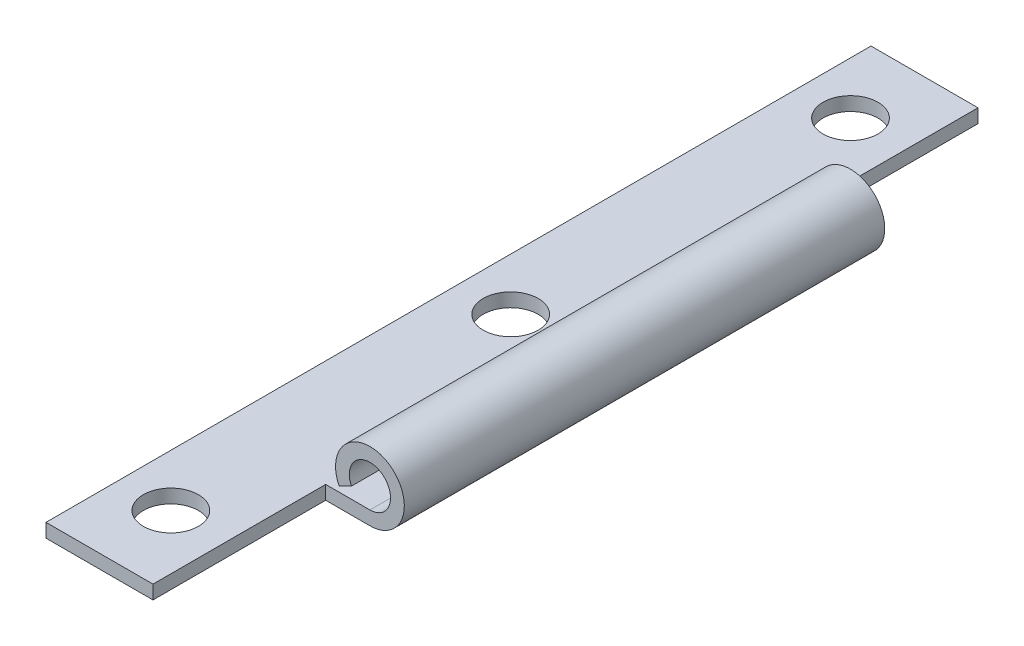
ISO-10303-21;
HEADER;
FILE_DESCRIPTION(('STEP AP214'),'2;1');
FILE_NAME('part.step','',(''),(''),'','','');
FILE_SCHEMA(('AUTOMOTIVE_DESIGN { 1 0 10303 214 1 1 1 1 }'));
ENDSEC;
DATA;
#1=APPLICATION_CONTEXT('core data for automotive mechanical design processes');
#2=APPLICATION_PROTOCOL_DEFINITION('international standard','automotive_design',2000,#1);
#3=PRODUCT_CONTEXT('',#1,'mechanical');
#4=PRODUCT('Part','Part','',(#3));
#5=PRODUCT_RELATED_PRODUCT_CATEGORY('part','',(#4));
#6=PRODUCT_DEFINITION_FORMATION('','',#4);
#7=PRODUCT_DEFINITION_CONTEXT('part definition',#1,'design');
#8=PRODUCT_DEFINITION('design','',#6,#7);
#9=PRODUCT_DEFINITION_SHAPE('','',#8);
#10=(LENGTH_UNIT() NAMED_UNIT(*) SI_UNIT(.MILLI.,.METRE.));
#11=(NAMED_UNIT(*) PLANE_ANGLE_UNIT() SI_UNIT($,.RADIAN.));
#12=(NAMED_UNIT(*) SI_UNIT($,.STERADIAN.) SOLID_ANGLE_UNIT());
#13=UNCERTAINTY_MEASURE_WITH_UNIT(LENGTH_MEASURE(1.E-05),#10,'distance_accuracy_value','');
#14=(GEOMETRIC_REPRESENTATION_CONTEXT(3) GLOBAL_UNCERTAINTY_ASSIGNED_CONTEXT((#13)) GLOBAL_UNIT_ASSIGNED_CONTEXT((#10,
#11,#12)) REPRESENTATION_CONTEXT('',''));
#15=CARTESIAN_POINT('',(0.,0.,0.));
#16=DIRECTION('',(0.,0.,1.));
#17=DIRECTION('',(1.,0.,0.));
#18=AXIS2_PLACEMENT_3D('',#15,#16,#17);
#19=CARTESIAN_POINT('',(11.,2.5,0.));
#20=DIRECTION('',(0.,0.,1.));
#21=DIRECTION('',(1.,0.,0.));
#22=AXIS2_PLACEMENT_3D('',#19,#20,#21);
#23=CYLINDRICAL_SURFACE('',#22,1.5);
#24=CARTESIAN_POINT('',(11.,2.5,12.5));
#25=DIRECTION('',(0.,0.,1.));
#26=DIRECTION('',(0.,-1.,0.));
#27=AXIS2_PLACEMENT_3D('',#24,#25,#26);
#28=CIRCLE('',#27,1.5);
#29=CARTESIAN_POINT('',(11.,0.999999999999996,12.5));
#30=VERTEX_POINT('',#29);
#31=CARTESIAN_POINT('',(9.65746444339179,1.83097213866484,12.5));
#32=VERTEX_POINT('',#31);
#33=EDGE_CURVE('E46',#30,#32,#28,.T.);
#34=ORIENTED_EDGE('',*,*,#33,.F.);
#35=DIRECTION('',(0.,0.,1.));
#36=VECTOR('',#35,1.);
#37=CARTESIAN_POINT('',(11.,1.,0.));
#38=LINE('',#37,#36);
#39=CARTESIAN_POINT('',(11.,0.999999999999996,47.4412303069812));
#40=VERTEX_POINT('',#39);
#41=EDGE_CURVE('E164',#30,#40,#38,.T.);
#42=ORIENTED_EDGE('',*,*,#41,.T.);
#43=CARTESIAN_POINT('',(11.,2.5,47.4412303069812));
#44=DIRECTION('',(0.,0.,-1.));
#45=DIRECTION('',(0.,1.,0.));
#46=AXIS2_PLACEMENT_3D('',#43,#44,#45);
#47=CIRCLE('',#46,1.5);
#48=CARTESIAN_POINT('',(9.65746444339179,1.83097213866484,47.4412303069812));
#49=VERTEX_POINT('',#48);
#50=EDGE_CURVE('E150',#49,#40,#47,.T.);
#51=ORIENTED_EDGE('',*,*,#50,.F.);
#52=DIRECTION('',(0.,0.,1.));
#53=VECTOR('',#52,1.);
#54=CARTESIAN_POINT('',(9.65746444339179,1.83097213866484,0.));
#55=LINE('',#54,#53);
#56=EDGE_CURVE('E188',#32,#49,#55,.T.);
#57=ORIENTED_EDGE('',*,*,#56,.F.);
#58=EDGE_LOOP('',(#34,#42,#51,#57));
#59=FACE_BOUND('',#58,.T.);
#60=ADVANCED_FACE('F33',(#59),#23,.F.);
#61=CARTESIAN_POINT('',(11.,2.5,0.));
#62=DIRECTION('',(0.,0.,1.));
#63=DIRECTION('',(1.,0.,0.));
#64=AXIS2_PLACEMENT_3D('',#61,#62,#63);
#65=CYLINDRICAL_SURFACE('',#64,2.5);
#66=CARTESIAN_POINT('',(11.,2.5,12.5));
#67=DIRECTION('',(0.,0.,1.));
#68=DIRECTION('',(0.,-1.,0.));
#69=AXIS2_PLACEMENT_3D('',#66,#67,#68);
#70=CIRCLE('',#69,2.5);
#71=CARTESIAN_POINT('',(8.76244073898632,1.3849535644414,12.5));
#72=VERTEX_POINT('',#71);
#73=CARTESIAN_POINT('',(11.,0.,12.5));
#74=VERTEX_POINT('',#73);
#75=EDGE_CURVE('E122',#72,#74,#70,.F.);
#76=ORIENTED_EDGE('',*,*,#75,.F.);
#77=DIRECTION('',(0.,0.,-1.));
#78=VECTOR('',#77,1.);
#79=CARTESIAN_POINT('',(8.76244073898632,1.38495356444141,0.));
#80=LINE('',#79,#78);
#81=CARTESIAN_POINT('',(8.76244073898632,1.3849535644414,47.4412303069812));
#82=VERTEX_POINT('',#81);
#83=EDGE_CURVE('E185',#82,#72,#80,.T.);
#84=ORIENTED_EDGE('',*,*,#83,.F.);
#85=CARTESIAN_POINT('',(11.,2.5,47.4412303069812));
#86=DIRECTION('',(0.,0.,-1.));
#87=DIRECTION('',(0.,1.,0.));
#88=AXIS2_PLACEMENT_3D('',#85,#86,#87);
#89=CIRCLE('',#88,2.5);
#90=CARTESIAN_POINT('',(11.,0.,47.4412303069812));
#91=VERTEX_POINT('',#90);
#92=EDGE_CURVE('E54',#91,#82,#89,.F.);
#93=ORIENTED_EDGE('',*,*,#92,.F.);
#94=DIRECTION('',(0.,0.,-1.));
#95=VECTOR('',#94,1.);
#96=CARTESIAN_POINT('',(11.,0.,0.));
#97=LINE('',#96,#95);
#98=EDGE_CURVE('E166',#91,#74,#97,.T.);
#99=ORIENTED_EDGE('',*,*,#98,.T.);
#100=EDGE_LOOP('',(#76,#84,#93,#99));
#101=FACE_BOUND('',#100,.T.);
#102=ADVANCED_FACE('F220',(#101),#65,.T.);
#103=CARTESIAN_POINT('',(11.,0.,0.));
#104=DIRECTION('',(0.,0.,1.));
#105=DIRECTION('',(1.,0.,0.));
#106=AXIS2_PLACEMENT_3D('',#103,#104,#105);
#107=PLANE('',#106);
#108=DIRECTION('',(-1.,0.,0.));
#109=VECTOR('',#108,1.);
#110=CARTESIAN_POINT('',(11.,1.,0.));
#111=LINE('',#110,#109);
#112=CARTESIAN_POINT('',(7.78103687233056,1.,0.));
#113=VERTEX_POINT('',#112);
#114=CARTESIAN_POINT('',(0.,1.,0.));
#115=VERTEX_POINT('',#114);
#116=EDGE_CURVE('E183',#113,#115,#111,.T.);
#117=ORIENTED_EDGE('',*,*,#116,.F.);
#118=DIRECTION('',(0.,-1.,0.));
#119=VECTOR('',#118,1.);
#120=CARTESIAN_POINT('',(7.78103687233056,0.,0.));
#121=LINE('',#120,#119);
#122=CARTESIAN_POINT('',(7.78103687233056,0.,0.));
#123=VERTEX_POINT('',#122);
#124=EDGE_CURVE('E143',#113,#123,#121,.T.);
#125=ORIENTED_EDGE('',*,*,#124,.T.);
#126=DIRECTION('',(-1.,0.,0.));
#127=VECTOR('',#126,1.);
#128=CARTESIAN_POINT('',(11.,0.,0.));
#129=LINE('',#128,#127);
#130=CARTESIAN_POINT('',(0.,0.,0.));
#131=VERTEX_POINT('',#130);
#132=EDGE_CURVE('E130',#123,#131,#129,.T.);
#133=ORIENTED_EDGE('',*,*,#132,.T.);
#134=DIRECTION('',(0.,1.,0.));
#135=VECTOR('',#134,1.);
#136=CARTESIAN_POINT('',(0.,0.,0.));
#137=LINE('',#136,#135);
#138=EDGE_CURVE('E163',#131,#115,#137,.T.);
#139=ORIENTED_EDGE('',*,*,#138,.T.);
#140=EDGE_LOOP('',(#117,#125,#133,#139));
#141=FACE_BOUND('',#140,.T.);
#142=ADVANCED_FACE('F207',(#141),#107,.F.);
#143=CARTESIAN_POINT('',(11.,1.,0.));
#144=DIRECTION('',(0.,-1.,0.));
#145=DIRECTION('',(0.,0.,-1.));
#146=AXIS2_PLACEMENT_3D('',#143,#144,#145);
#147=PLANE('',#146);
#148=CARTESIAN_POINT('',(3.79458369093268,0.999999999999996,30.));
#149=DIRECTION('',(0.,1.,0.));
#150=DIRECTION('',(0.,0.,1.));
#151=AXIS2_PLACEMENT_3D('',#148,#149,#150);
#152=CIRCLE('',#151,2.);
#153=CARTESIAN_POINT('',(3.79458369093268,0.999999999999996,32.));
#154=VERTEX_POINT('',#153);
#155=EDGE_CURVE('E267',#154,#154,#152,.T.);
#156=ORIENTED_EDGE('',*,*,#155,.F.);
#157=EDGE_LOOP('',(#156));
#158=FACE_BOUND('',#157,.T.);
#159=CARTESIAN_POINT('',(3.79458369093236,0.999999999999993,54.7141334830729));
#160=DIRECTION('',(0.,1.,0.));
#161=DIRECTION('',(0.,0.,-1.));
#162=AXIS2_PLACEMENT_3D('',#159,#160,#161);
#163=CIRCLE('',#162,2.);
#164=CARTESIAN_POINT('',(3.79458369093236,0.999999999999994,52.7141334830729));
#165=VERTEX_POINT('',#164);
#166=EDGE_CURVE('E269',#165,#165,#163,.T.);
#167=ORIENTED_EDGE('',*,*,#166,.F.);
#168=EDGE_LOOP('',(#167));
#169=FACE_BOUND('',#168,.T.);
#170=CARTESIAN_POINT('',(3.79458369093236,0.999999999999999,5.28586651692707));
#171=DIRECTION('',(0.,1.,0.));
#172=DIRECTION('',(0.,0.,1.));
#173=AXIS2_PLACEMENT_3D('',#170,#171,#172);
#174=CIRCLE('',#173,2.);
#175=CARTESIAN_POINT('',(3.79458369093236,0.999999999999999,7.28586651692707));
#176=VERTEX_POINT('',#175);
#177=EDGE_CURVE('E134',#176,#176,#174,.T.);
#178=ORIENTED_EDGE('',*,*,#177,.F.);
#179=EDGE_LOOP('',(#178));
#180=FACE_BOUND('',#179,.T.);
#181=DIRECTION('',(-1.,0.,0.));
#182=VECTOR('',#181,1.);
#183=CARTESIAN_POINT('',(11.,0.999999999999999,12.5));
#184=LINE('',#183,#182);
#185=CARTESIAN_POINT('',(7.78103687233056,0.999999999999998,12.5));
#186=VERTEX_POINT('',#185);
#187=EDGE_CURVE('E139',#30,#186,#184,.T.);
#188=ORIENTED_EDGE('',*,*,#187,.T.);
#189=DIRECTION('',(0.,0.,-1.));
#190=VECTOR('',#189,1.);
#191=CARTESIAN_POINT('',(7.78103687233056,1.,0.));
#192=LINE('',#191,#190);
#193=EDGE_CURVE('E116',#186,#113,#192,.T.);
#194=ORIENTED_EDGE('',*,*,#193,.T.);
#195=ORIENTED_EDGE('',*,*,#116,.T.);
#196=DIRECTION('',(0.,0.,1.));
#197=VECTOR('',#196,1.);
#198=CARTESIAN_POINT('',(0.,1.,0.));
#199=LINE('',#198,#197);
#200=CARTESIAN_POINT('',(0.,0.999999999999993,60.));
#201=VERTEX_POINT('',#200);
#202=EDGE_CURVE('E171',#115,#201,#199,.T.);
#203=ORIENTED_EDGE('',*,*,#202,.T.);
#204=DIRECTION('',(-1.,0.,0.));
#205=VECTOR('',#204,1.);
#206=CARTESIAN_POINT('',(11.,0.999999999999993,60.));
#207=LINE('',#206,#205);
#208=CARTESIAN_POINT('',(7.78103687233056,0.999999999999993,60.));
#209=VERTEX_POINT('',#208);
#210=EDGE_CURVE('E181',#209,#201,#207,.T.);
#211=ORIENTED_EDGE('',*,*,#210,.F.);
#212=DIRECTION('',(0.,0.,-1.));
#213=VECTOR('',#212,1.);
#214=CARTESIAN_POINT('',(7.78103687233056,1.,0.));
#215=LINE('',#214,#213);
#216=CARTESIAN_POINT('',(7.78103687233056,0.999999999999994,47.4412303069812));
#217=VERTEX_POINT('',#216);
#218=EDGE_CURVE('E160',#209,#217,#215,.T.);
#219=ORIENTED_EDGE('',*,*,#218,.T.);
#220=DIRECTION('',(1.,0.,0.));
#221=VECTOR('',#220,1.);
#222=CARTESIAN_POINT('',(11.,0.999999999999994,47.4412303069812));
#223=LINE('',#222,#221);
#224=EDGE_CURVE('E153',#217,#40,#223,.T.);
#225=ORIENTED_EDGE('',*,*,#224,.T.);
#226=ORIENTED_EDGE('',*,*,#41,.F.);
#227=EDGE_LOOP('',(#188,#194,#195,#203,#211,#219,#225,#226));
#228=FACE_BOUND('',#227,.T.);
#229=ADVANCED_FACE('F209',(#158,#169,#180,#228),#147,.F.);
#230=CARTESIAN_POINT('',(11.,0.,60.));
#231=DIRECTION('',(0.,0.,-1.));
#232=DIRECTION('',(-1.,0.,0.));
#233=AXIS2_PLACEMENT_3D('',#230,#231,#232);
#234=PLANE('',#233);
#235=DIRECTION('',(-1.,0.,0.));
#236=VECTOR('',#235,1.);
#237=CARTESIAN_POINT('',(11.,0.,60.));
#238=LINE('',#237,#236);
#239=CARTESIAN_POINT('',(7.78103687233056,0.,60.));
#240=VERTEX_POINT('',#239);
#241=CARTESIAN_POINT('',(0.,0.,60.));
#242=VERTEX_POINT('',#241);
#243=EDGE_CURVE('E179',#240,#242,#238,.T.);
#244=ORIENTED_EDGE('',*,*,#243,.F.);
#245=DIRECTION('',(0.,1.,0.));
#246=VECTOR('',#245,1.);
#247=CARTESIAN_POINT('',(7.78103687233056,0.,60.));
#248=LINE('',#247,#246);
#249=EDGE_CURVE('E152',#240,#209,#248,.T.);
#250=ORIENTED_EDGE('',*,*,#249,.T.);
#251=ORIENTED_EDGE('',*,*,#210,.T.);
#252=DIRECTION('',(0.,-1.,0.));
#253=VECTOR('',#252,1.);
#254=CARTESIAN_POINT('',(0.,0.,60.));
#255=LINE('',#254,#253);
#256=EDGE_CURVE('E174',#201,#242,#255,.T.);
#257=ORIENTED_EDGE('',*,*,#256,.T.);
#258=EDGE_LOOP('',(#244,#250,#251,#257));
#259=FACE_BOUND('',#258,.T.);
#260=ADVANCED_FACE('F197',(#259),#234,.F.);
#261=CARTESIAN_POINT('',(11.,0.,0.));
#262=DIRECTION('',(0.,1.,0.));
#263=DIRECTION('',(0.,0.,1.));
#264=AXIS2_PLACEMENT_3D('',#261,#262,#263);
#265=PLANE('',#264);
#266=CARTESIAN_POINT('',(3.79458369093268,0.,30.));
#267=DIRECTION('',(0.,1.,0.));
#268=DIRECTION('',(0.,0.,1.));
#269=AXIS2_PLACEMENT_3D('',#266,#267,#268);
#270=CIRCLE('',#269,2.);
#271=CARTESIAN_POINT('',(3.79458369093268,0.,32.));
#272=VERTEX_POINT('',#271);
#273=EDGE_CURVE('E264',#272,#272,#270,.T.);
#274=ORIENTED_EDGE('',*,*,#273,.T.);
#275=EDGE_LOOP('',(#274));
#276=FACE_BOUND('',#275,.T.);
#277=CARTESIAN_POINT('',(3.79458369093236,0.,54.7141334830729));
#278=DIRECTION('',(0.,1.,0.));
#279=DIRECTION('',(0.,0.,-1.));
#280=AXIS2_PLACEMENT_3D('',#277,#278,#279);
#281=CIRCLE('',#280,2.);
#282=CARTESIAN_POINT('',(3.79458369093236,0.,52.7141334830729));
#283=VERTEX_POINT('',#282);
#284=EDGE_CURVE('E272',#283,#283,#281,.T.);
#285=ORIENTED_EDGE('',*,*,#284,.T.);
#286=EDGE_LOOP('',(#285));
#287=FACE_BOUND('',#286,.T.);
#288=CARTESIAN_POINT('',(3.79458369093236,0.,5.28586651692707));
#289=DIRECTION('',(0.,1.,0.));
#290=DIRECTION('',(0.,0.,1.));
#291=AXIS2_PLACEMENT_3D('',#288,#289,#290);
#292=CIRCLE('',#291,2.);
#293=CARTESIAN_POINT('',(3.79458369093236,0.,7.28586651692707));
#294=VERTEX_POINT('',#293);
#295=EDGE_CURVE('E131',#294,#294,#292,.T.);
#296=ORIENTED_EDGE('',*,*,#295,.T.);
#297=EDGE_LOOP('',(#296));
#298=FACE_BOUND('',#297,.T.);
#299=ORIENTED_EDGE('',*,*,#132,.F.);
#300=DIRECTION('',(0.,0.,-1.));
#301=VECTOR('',#300,1.);
#302=CARTESIAN_POINT('',(7.78103687233056,0.,-0.967623064578414));
#303=LINE('',#302,#301);
#304=CARTESIAN_POINT('',(7.78103687233056,0.,12.5));
#305=VERTEX_POINT('',#304);
#306=EDGE_CURVE('E113',#305,#123,#303,.T.);
#307=ORIENTED_EDGE('',*,*,#306,.F.);
#308=DIRECTION('',(-1.,0.,0.));
#309=VECTOR('',#308,1.);
#310=CARTESIAN_POINT('',(16.0412965863501,0.,12.5));
#311=LINE('',#310,#309);
#312=EDGE_CURVE('E118',#74,#305,#311,.T.);
#313=ORIENTED_EDGE('',*,*,#312,.F.);
#314=ORIENTED_EDGE('',*,*,#98,.F.);
#315=DIRECTION('',(1.,0.,0.));
#316=VECTOR('',#315,1.);
#317=CARTESIAN_POINT('',(15.8791395617148,0.,47.4412303069812));
#318=LINE('',#317,#316);
#319=CARTESIAN_POINT('',(7.78103687233056,0.,47.4412303069812));
#320=VERTEX_POINT('',#319);
#321=EDGE_CURVE('E145',#320,#91,#318,.T.);
#322=ORIENTED_EDGE('',*,*,#321,.F.);
#323=DIRECTION('',(0.,0.,1.));
#324=VECTOR('',#323,1.);
#325=CARTESIAN_POINT('',(7.78103687233056,0.,0.));
#326=LINE('',#325,#324);
#327=EDGE_CURVE('E40',#320,#240,#326,.T.);
#328=ORIENTED_EDGE('',*,*,#327,.T.);
#329=ORIENTED_EDGE('',*,*,#243,.T.);
#330=DIRECTION('',(0.,0.,-1.));
#331=VECTOR('',#330,1.);
#332=CARTESIAN_POINT('',(0.,0.,0.));
#333=LINE('',#332,#331);
#334=EDGE_CURVE('E167',#242,#131,#333,.T.);
#335=ORIENTED_EDGE('',*,*,#334,.T.);
#336=EDGE_LOOP('',(#299,#307,#313,#314,#322,#328,#329,#335));
#337=FACE_BOUND('',#336,.T.);
#338=ADVANCED_FACE('F128',(#276,#287,#298,#337),#265,.F.);
#339=CARTESIAN_POINT('',(8.76244073898632,1.38495356444141,0.));
#340=DIRECTION('',(0.446018574223438,-0.895023704405471,0.));
#341=DIRECTION('',(0.,0.,-1.));
#342=AXIS2_PLACEMENT_3D('',#339,#340,#341);
#343=PLANE('',#342);
#344=DIRECTION('',(-0.895023704405471,-0.446018574223438,0.));
#345=VECTOR('',#344,1.);
#346=CARTESIAN_POINT('',(8.76244073898632,1.38495356444141,12.5));
#347=LINE('',#346,#345);
#348=EDGE_CURVE('E11',#32,#72,#347,.T.);
#349=ORIENTED_EDGE('',*,*,#348,.F.);
#350=ORIENTED_EDGE('',*,*,#56,.T.);
#351=DIRECTION('',(0.895023704405471,0.446018574223438,0.));
#352=VECTOR('',#351,1.);
#353=CARTESIAN_POINT('',(8.76244073898632,1.38495356444141,47.4412303069812));
#354=LINE('',#353,#352);
#355=EDGE_CURVE('E190',#82,#49,#354,.T.);
#356=ORIENTED_EDGE('',*,*,#355,.F.);
#357=ORIENTED_EDGE('',*,*,#83,.T.);
#358=EDGE_LOOP('',(#349,#350,#356,#357));
#359=FACE_BOUND('',#358,.T.);
#360=ADVANCED_FACE('F215',(#359),#343,.T.);
#361=CARTESIAN_POINT('',(0.,0.,0.));
#362=DIRECTION('',(1.,0.,0.));
#363=DIRECTION('',(0.,0.,-1.));
#364=AXIS2_PLACEMENT_3D('',#361,#362,#363);
#365=PLANE('',#364);
#366=ORIENTED_EDGE('',*,*,#138,.F.);
#367=ORIENTED_EDGE('',*,*,#334,.F.);
#368=ORIENTED_EDGE('',*,*,#256,.F.);
#369=ORIENTED_EDGE('',*,*,#202,.F.);
#370=EDGE_LOOP('',(#366,#367,#368,#369));
#371=FACE_BOUND('',#370,.T.);
#372=ADVANCED_FACE('F204',(#371),#365,.F.);
#373=CARTESIAN_POINT('',(7.78103687233056,5.00000000000001,61.6580896400575));
#374=DIRECTION('',(-1.,0.,0.));
#375=DIRECTION('',(0.,0.,1.));
#376=AXIS2_PLACEMENT_3D('',#373,#374,#375);
#377=PLANE('',#376);
#378=ORIENTED_EDGE('',*,*,#249,.F.);
#379=ORIENTED_EDGE('',*,*,#327,.F.);
#380=DIRECTION('',(0.,-1.,0.));
#381=VECTOR('',#380,1.);
#382=CARTESIAN_POINT('',(7.78103687233056,5.00000000000001,47.4412303069812));
#383=LINE('',#382,#381);
#384=EDGE_CURVE('E147',#217,#320,#383,.T.);
#385=ORIENTED_EDGE('',*,*,#384,.F.);
#386=ORIENTED_EDGE('',*,*,#218,.F.);
#387=EDGE_LOOP('',(#378,#379,#385,#386));
#388=FACE_BOUND('',#387,.T.);
#389=ADVANCED_FACE('F218',(#388),#377,.F.);
#390=CARTESIAN_POINT('',(15.8791395617148,5.00000000000001,47.4412303069812));
#391=DIRECTION('',(0.,0.,-1.));
#392=DIRECTION('',(0.,1.,0.));
#393=AXIS2_PLACEMENT_3D('',#390,#391,#392);
#394=PLANE('',#393);
#395=ORIENTED_EDGE('',*,*,#92,.T.);
#396=ORIENTED_EDGE('',*,*,#355,.T.);
#397=ORIENTED_EDGE('',*,*,#50,.T.);
#398=ORIENTED_EDGE('',*,*,#224,.F.);
#399=ORIENTED_EDGE('',*,*,#384,.T.);
#400=ORIENTED_EDGE('',*,*,#321,.T.);
#401=EDGE_LOOP('',(#395,#396,#397,#398,#399,#400));
#402=FACE_BOUND('',#401,.T.);
#403=ADVANCED_FACE('F217',(#402),#394,.F.);
#404=CARTESIAN_POINT('',(7.78103687233056,5.00000000000002,-0.967623064578414));
#405=DIRECTION('',(-1.,0.,0.));
#406=DIRECTION('',(0.,0.,1.));
#407=AXIS2_PLACEMENT_3D('',#404,#405,#406);
#408=PLANE('',#407);
#409=ORIENTED_EDGE('',*,*,#193,.F.);
#410=DIRECTION('',(0.,-1.,0.));
#411=VECTOR('',#410,1.);
#412=CARTESIAN_POINT('',(7.78103687233056,5.00000000000001,12.5));
#413=LINE('',#412,#411);
#414=EDGE_CURVE('E109',#186,#305,#413,.T.);
#415=ORIENTED_EDGE('',*,*,#414,.T.);
#416=ORIENTED_EDGE('',*,*,#306,.T.);
#417=ORIENTED_EDGE('',*,*,#124,.F.);
#418=EDGE_LOOP('',(#409,#415,#416,#417));
#419=FACE_BOUND('',#418,.T.);
#420=ADVANCED_FACE('F111',(#419),#408,.F.);
#421=CARTESIAN_POINT('',(16.0412965863501,5.00000000000001,12.5));
#422=DIRECTION('',(0.,0.,1.));
#423=DIRECTION('',(0.,-1.,0.));
#424=AXIS2_PLACEMENT_3D('',#421,#422,#423);
#425=PLANE('',#424);
#426=ORIENTED_EDGE('',*,*,#75,.T.);
#427=ORIENTED_EDGE('',*,*,#312,.T.);
#428=ORIENTED_EDGE('',*,*,#414,.F.);
#429=ORIENTED_EDGE('',*,*,#187,.F.);
#430=ORIENTED_EDGE('',*,*,#33,.T.);
#431=ORIENTED_EDGE('',*,*,#348,.T.);
#432=EDGE_LOOP('',(#426,#427,#428,#429,#430,#431));
#433=FACE_BOUND('',#432,.T.);
#434=ADVANCED_FACE('F121',(#433),#425,.F.);
#435=CARTESIAN_POINT('',(3.79458369093236,0.,5.28586651692707));
#436=DIRECTION('',(0.,1.,0.));
#437=DIRECTION('',(0.,0.,1.));
#438=AXIS2_PLACEMENT_3D('',#435,#436,#437);
#439=CYLINDRICAL_SURFACE('',#438,2.);
#440=ORIENTED_EDGE('',*,*,#295,.F.);
#441=EDGE_LOOP('',(#440));
#442=FACE_BOUND('',#441,.T.);
#443=ORIENTED_EDGE('',*,*,#177,.T.);
#444=EDGE_LOOP('',(#443));
#445=FACE_BOUND('',#444,.T.);
#446=ADVANCED_FACE('F248',(#442,#445),#439,.F.);
#447=CARTESIAN_POINT('',(3.79458369093236,0.,54.7141334830729));
#448=DIRECTION('',(0.,1.,0.));
#449=DIRECTION('',(0.,0.,1.));
#450=AXIS2_PLACEMENT_3D('',#447,#448,#449);
#451=CYLINDRICAL_SURFACE('',#450,2.);
#452=ORIENTED_EDGE('',*,*,#284,.F.);
#453=EDGE_LOOP('',(#452));
#454=FACE_BOUND('',#453,.T.);
#455=ORIENTED_EDGE('',*,*,#166,.T.);
#456=EDGE_LOOP('',(#455));
#457=FACE_BOUND('',#456,.T.);
#458=ADVANCED_FACE('F251',(#454,#457),#451,.F.);
#459=CARTESIAN_POINT('',(3.79458369093268,0.,30.));
#460=DIRECTION('',(0.,1.,0.));
#461=DIRECTION('',(0.,0.,1.));
#462=AXIS2_PLACEMENT_3D('',#459,#460,#461);
#463=CYLINDRICAL_SURFACE('',#462,2.);
#464=ORIENTED_EDGE('',*,*,#273,.F.);
#465=EDGE_LOOP('',(#464));
#466=FACE_BOUND('',#465,.T.);
#467=ORIENTED_EDGE('',*,*,#155,.T.);
#468=EDGE_LOOP('',(#467));
#469=FACE_BOUND('',#468,.T.);
#470=ADVANCED_FACE('F255',(#466,#469),#463,.F.);
#471=CLOSED_SHELL('',(#60,#102,#142,#229,#260,#338,#360,#372,#389,#403,#420,#434,#446,#458,#470));
#472=MANIFOLD_SOLID_BREP('B2',#471);
#473=ADVANCED_BREP_SHAPE_REPRESENTATION('',(#18,#472),#14);
#474=SHAPE_DEFINITION_REPRESENTATION(#9,#473);
ENDSEC;
END-ISO-10303-21;
